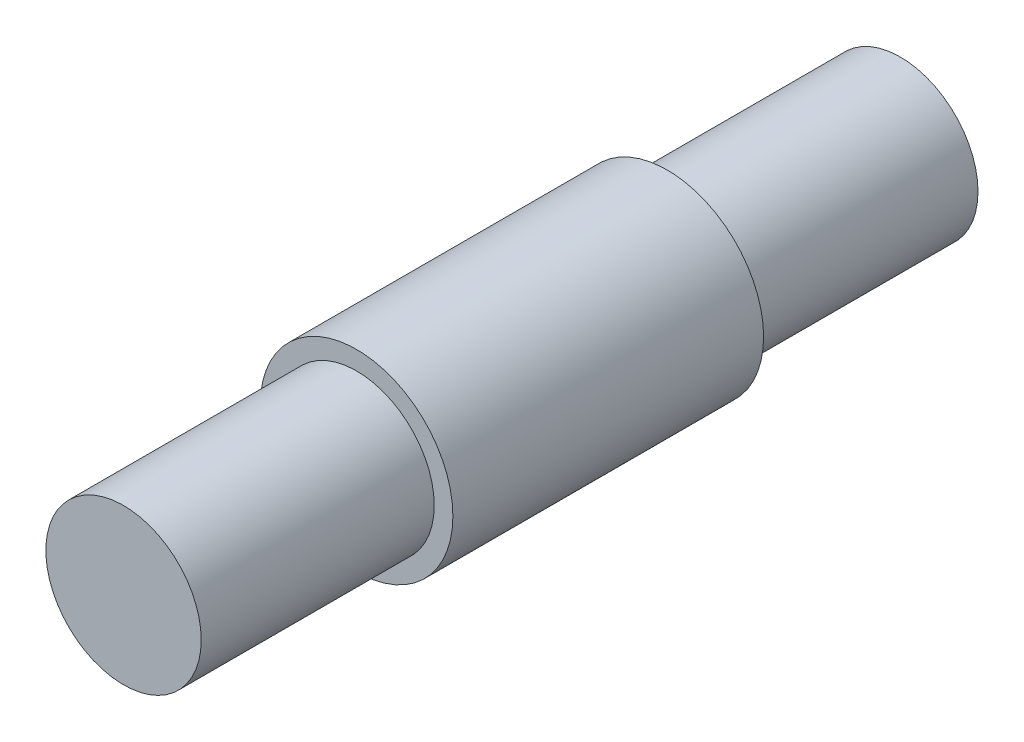
ISO-10303-21;
HEADER;
FILE_DESCRIPTION(('STEP AP214'),'2;1');
FILE_NAME('part.step','',(''),(''),'','','');
FILE_SCHEMA(('AUTOMOTIVE_DESIGN { 1 0 10303 214 1 1 1 1 }'));
ENDSEC;
DATA;
#1=APPLICATION_CONTEXT('core data for automotive mechanical design processes');
#2=APPLICATION_PROTOCOL_DEFINITION('international standard','automotive_design',2000,#1);
#3=PRODUCT_CONTEXT('',#1,'mechanical');
#4=PRODUCT('Part','Part','',(#3));
#5=PRODUCT_RELATED_PRODUCT_CATEGORY('part','',(#4));
#6=PRODUCT_DEFINITION_FORMATION('','',#4);
#7=PRODUCT_DEFINITION_CONTEXT('part definition',#1,'design');
#8=PRODUCT_DEFINITION('design','',#6,#7);
#9=PRODUCT_DEFINITION_SHAPE('','',#8);
#10=(LENGTH_UNIT() NAMED_UNIT(*) SI_UNIT(.MILLI.,.METRE.));
#11=(NAMED_UNIT(*) PLANE_ANGLE_UNIT() SI_UNIT($,.RADIAN.));
#12=(NAMED_UNIT(*) SI_UNIT($,.STERADIAN.) SOLID_ANGLE_UNIT());
#13=UNCERTAINTY_MEASURE_WITH_UNIT(LENGTH_MEASURE(1.E-05),#10,'distance_accuracy_value','');
#14=(GEOMETRIC_REPRESENTATION_CONTEXT(3) GLOBAL_UNCERTAINTY_ASSIGNED_CONTEXT((#13)) GLOBAL_UNIT_ASSIGNED_CONTEXT((#10,
#11,#12)) REPRESENTATION_CONTEXT('',''));
#15=CARTESIAN_POINT('',(0.,0.,0.));
#16=DIRECTION('',(0.,0.,1.));
#17=DIRECTION('',(1.,0.,0.));
#18=AXIS2_PLACEMENT_3D('',#15,#16,#17);
#19=CARTESIAN_POINT('',(0.,0.,12.7));
#20=DIRECTION('',(0.,0.,-1.));
#21=DIRECTION('',(-1.,0.,0.));
#22=AXIS2_PLACEMENT_3D('',#19,#20,#21);
#23=CYLINDRICAL_SURFACE('',#22,3.937);
#24=CARTESIAN_POINT('',(0.,0.,12.7));
#25=DIRECTION('',(0.,0.,1.));
#26=DIRECTION('',(1.,0.,0.));
#27=AXIS2_PLACEMENT_3D('',#24,#25,#26);
#28=CIRCLE('',#27,3.937);
#29=CARTESIAN_POINT('',(3.937,0.,12.7));
#30=VERTEX_POINT('',#29);
#31=EDGE_CURVE('E49',#30,#30,#28,.T.);
#32=ORIENTED_EDGE('',*,*,#31,.F.);
#33=EDGE_LOOP('',(#32));
#34=FACE_BOUND('',#33,.T.);
#35=CARTESIAN_POINT('',(0.,0.,0.));
#36=DIRECTION('',(0.,0.,1.));
#37=DIRECTION('',(1.,0.,0.));
#38=AXIS2_PLACEMENT_3D('',#35,#36,#37);
#39=CIRCLE('',#38,3.937);
#40=CARTESIAN_POINT('',(3.937,0.,0.));
#41=VERTEX_POINT('',#40);
#42=EDGE_CURVE('E55',#41,#41,#39,.T.);
#43=ORIENTED_EDGE('',*,*,#42,.T.);
#44=EDGE_LOOP('',(#43));
#45=FACE_BOUND('',#44,.T.);
#46=ADVANCED_FACE('F41',(#34,#45),#23,.T.);
#47=CARTESIAN_POINT('',(0.,0.,12.7));
#48=DIRECTION('',(0.,0.,1.));
#49=DIRECTION('',(1.,0.,0.));
#50=AXIS2_PLACEMENT_3D('',#47,#48,#49);
#51=PLANE('',#50);
#52=CARTESIAN_POINT('',(0.,0.,12.7));
#53=DIRECTION('',(0.,0.,1.));
#54=DIRECTION('',(1.,0.,0.));
#55=AXIS2_PLACEMENT_3D('',#52,#53,#54);
#56=CIRCLE('',#55,3.175);
#57=CARTESIAN_POINT('',(3.175,0.,12.7));
#58=VERTEX_POINT('',#57);
#59=EDGE_CURVE('E10',#58,#58,#56,.T.);
#60=ORIENTED_EDGE('',*,*,#59,.F.);
#61=EDGE_LOOP('',(#60));
#62=FACE_BOUND('',#61,.T.);
#63=ORIENTED_EDGE('',*,*,#31,.T.);
#64=EDGE_LOOP('',(#63));
#65=FACE_BOUND('',#64,.T.);
#66=ADVANCED_FACE('F92',(#62,#65),#51,.T.);
#67=CARTESIAN_POINT('',(0.,0.,0.));
#68=DIRECTION('',(0.,0.,1.));
#69=DIRECTION('',(1.,0.,0.));
#70=AXIS2_PLACEMENT_3D('',#67,#68,#69);
#71=PLANE('',#70);
#72=CARTESIAN_POINT('',(0.,0.,0.));
#73=DIRECTION('',(0.,0.,1.));
#74=DIRECTION('',(1.,0.,0.));
#75=AXIS2_PLACEMENT_3D('',#72,#73,#74);
#76=CIRCLE('',#75,3.175);
#77=CARTESIAN_POINT('',(3.175,0.,0.));
#78=VERTEX_POINT('',#77);
#79=EDGE_CURVE('E44',#78,#78,#76,.T.);
#80=ORIENTED_EDGE('',*,*,#79,.T.);
#81=EDGE_LOOP('',(#80));
#82=FACE_BOUND('',#81,.T.);
#83=ORIENTED_EDGE('',*,*,#42,.F.);
#84=EDGE_LOOP('',(#83));
#85=FACE_BOUND('',#84,.T.);
#86=ADVANCED_FACE('F97',(#82,#85),#71,.F.);
#87=CARTESIAN_POINT('',(0.,0.,-9.525));
#88=DIRECTION('',(0.,0.,1.));
#89=DIRECTION('',(1.,0.,0.));
#90=AXIS2_PLACEMENT_3D('',#87,#88,#89);
#91=PLANE('',#90);
#92=CARTESIAN_POINT('',(0.,0.,-9.525));
#93=DIRECTION('',(0.,0.,1.));
#94=DIRECTION('',(1.,0.,0.));
#95=AXIS2_PLACEMENT_3D('',#92,#93,#94);
#96=CIRCLE('',#95,3.175);
#97=CARTESIAN_POINT('',(3.175,0.,-9.525));
#98=VERTEX_POINT('',#97);
#99=EDGE_CURVE('E58',#98,#98,#96,.T.);
#100=ORIENTED_EDGE('',*,*,#99,.F.);
#101=EDGE_LOOP('',(#100));
#102=FACE_BOUND('',#101,.T.);
#103=ADVANCED_FACE('F88',(#102),#91,.F.);
#104=CARTESIAN_POINT('',(0.,0.,-9.525));
#105=DIRECTION('',(0.,0.,1.));
#106=DIRECTION('',(1.,0.,0.));
#107=AXIS2_PLACEMENT_3D('',#104,#105,#106);
#108=CYLINDRICAL_SURFACE('',#107,3.175);
#109=ORIENTED_EDGE('',*,*,#99,.T.);
#110=EDGE_LOOP('',(#109));
#111=FACE_BOUND('',#110,.T.);
#112=ORIENTED_EDGE('',*,*,#79,.F.);
#113=EDGE_LOOP('',(#112));
#114=FACE_BOUND('',#113,.T.);
#115=ADVANCED_FACE('F81',(#111,#114),#108,.T.);
#116=ORIENTED_EDGE('',*,*,#59,.T.);
#117=EDGE_LOOP('',(#116));
#118=FACE_BOUND('',#117,.T.);
#119=CARTESIAN_POINT('',(0.,0.,22.225));
#120=DIRECTION('',(0.,0.,1.));
#121=DIRECTION('',(1.,0.,0.));
#122=AXIS2_PLACEMENT_3D('',#119,#120,#121);
#123=CIRCLE('',#122,3.175);
#124=CARTESIAN_POINT('',(3.175,0.,22.225));
#125=VERTEX_POINT('',#124);
#126=EDGE_CURVE('E70',#125,#125,#123,.T.);
#127=ORIENTED_EDGE('',*,*,#126,.F.);
#128=EDGE_LOOP('',(#127));
#129=FACE_BOUND('',#128,.T.);
#130=ADVANCED_FACE('F79',(#118,#129),#108,.T.);
#131=CARTESIAN_POINT('',(0.,0.,22.225));
#132=DIRECTION('',(0.,0.,1.));
#133=DIRECTION('',(1.,0.,0.));
#134=AXIS2_PLACEMENT_3D('',#131,#132,#133);
#135=PLANE('',#134);
#136=ORIENTED_EDGE('',*,*,#126,.T.);
#137=EDGE_LOOP('',(#136));
#138=FACE_BOUND('',#137,.T.);
#139=ADVANCED_FACE('F77',(#138),#135,.T.);
#140=CLOSED_SHELL('',(#46,#66,#86,#103,#115,#130,#139));
#141=MANIFOLD_SOLID_BREP('B2',#140);
#142=ADVANCED_BREP_SHAPE_REPRESENTATION('',(#18,#141),#14);
#143=SHAPE_DEFINITION_REPRESENTATION(#9,#142);
ENDSEC;
END-ISO-10303-21;
